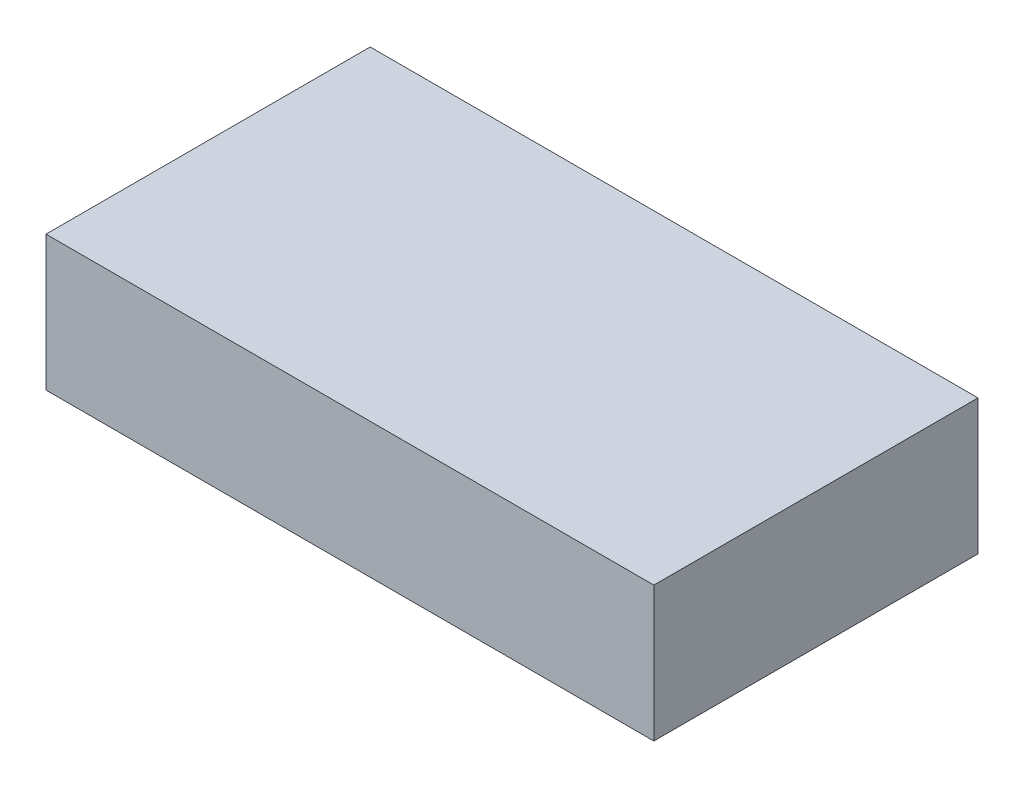
ISO-10303-21;
HEADER;
FILE_DESCRIPTION(('STEP AP214'),'2;1');
FILE_NAME('part.step','',(''),(''),'','','');
FILE_SCHEMA(('AUTOMOTIVE_DESIGN { 1 0 10303 214 1 1 1 1 }'));
ENDSEC;
DATA;
#1=APPLICATION_CONTEXT('core data for automotive mechanical design processes');
#2=APPLICATION_PROTOCOL_DEFINITION('international standard','automotive_design',2000,#1);
#3=PRODUCT_CONTEXT('',#1,'mechanical');
#4=PRODUCT('Part','Part','',(#3));
#5=PRODUCT_RELATED_PRODUCT_CATEGORY('part','',(#4));
#6=PRODUCT_DEFINITION_FORMATION('','',#4);
#7=PRODUCT_DEFINITION_CONTEXT('part definition',#1,'design');
#8=PRODUCT_DEFINITION('design','',#6,#7);
#9=PRODUCT_DEFINITION_SHAPE('','',#8);
#10=(LENGTH_UNIT() NAMED_UNIT(*) SI_UNIT(.MILLI.,.METRE.));
#11=(NAMED_UNIT(*) PLANE_ANGLE_UNIT() SI_UNIT($,.RADIAN.));
#12=(NAMED_UNIT(*) SI_UNIT($,.STERADIAN.) SOLID_ANGLE_UNIT());
#13=UNCERTAINTY_MEASURE_WITH_UNIT(LENGTH_MEASURE(1.E-05),#10,'distance_accuracy_value','');
#14=(GEOMETRIC_REPRESENTATION_CONTEXT(3) GLOBAL_UNCERTAINTY_ASSIGNED_CONTEXT((#13)) GLOBAL_UNIT_ASSIGNED_CONTEXT((#10,
#11,#12)) REPRESENTATION_CONTEXT('',''));
#15=CARTESIAN_POINT('',(0.,0.,0.));
#16=DIRECTION('',(0.,0.,1.));
#17=DIRECTION('',(1.,0.,0.));
#18=AXIS2_PLACEMENT_3D('',#15,#16,#17);
#19=CARTESIAN_POINT('',(0.,10.,0.));
#20=DIRECTION('',(1.,0.,0.));
#21=DIRECTION('',(0.,0.,-1.));
#22=AXIS2_PLACEMENT_3D('',#19,#20,#21);
#23=PLANE('',#22);
#24=DIRECTION('',(0.,0.,1.));
#25=VECTOR('',#24,1.);
#26=CARTESIAN_POINT('',(0.,0.,0.));
#27=LINE('',#26,#25);
#28=CARTESIAN_POINT('',(0.,0.,-24.));
#29=VERTEX_POINT('',#28);
#30=CARTESIAN_POINT('',(0.,0.,0.));
#31=VERTEX_POINT('',#30);
#32=EDGE_CURVE('E96',#29,#31,#27,.T.);
#33=ORIENTED_EDGE('',*,*,#32,.T.);
#34=DIRECTION('',(0.,-1.,0.));
#35=VECTOR('',#34,1.);
#36=CARTESIAN_POINT('',(0.,10.,0.));
#37=LINE('',#36,#35);
#38=CARTESIAN_POINT('',(0.,10.,0.));
#39=VERTEX_POINT('',#38);
#40=EDGE_CURVE('E11',#39,#31,#37,.T.);
#41=ORIENTED_EDGE('',*,*,#40,.F.);
#42=DIRECTION('',(0.,0.,1.));
#43=VECTOR('',#42,1.);
#44=CARTESIAN_POINT('',(0.,10.,0.));
#45=LINE('',#44,#43);
#46=CARTESIAN_POINT('',(0.,10.,-24.));
#47=VERTEX_POINT('',#46);
#48=EDGE_CURVE('E84',#47,#39,#45,.T.);
#49=ORIENTED_EDGE('',*,*,#48,.F.);
#50=DIRECTION('',(0.,-1.,0.));
#51=VECTOR('',#50,1.);
#52=CARTESIAN_POINT('',(0.,10.,-24.));
#53=LINE('',#52,#51);
#54=EDGE_CURVE('E92',#47,#29,#53,.T.);
#55=ORIENTED_EDGE('',*,*,#54,.T.);
#56=EDGE_LOOP('',(#33,#41,#49,#55));
#57=FACE_BOUND('',#56,.T.);
#58=ADVANCED_FACE('F33',(#57),#23,.F.);
#59=CARTESIAN_POINT('',(0.,10.,0.));
#60=DIRECTION('',(0.,0.,-1.));
#61=DIRECTION('',(-1.,0.,0.));
#62=AXIS2_PLACEMENT_3D('',#59,#60,#61);
#63=PLANE('',#62);
#64=DIRECTION('',(1.,0.,0.));
#65=VECTOR('',#64,1.);
#66=CARTESIAN_POINT('',(0.,0.,0.));
#67=LINE('',#66,#65);
#68=CARTESIAN_POINT('',(45.,0.,0.));
#69=VERTEX_POINT('',#68);
#70=EDGE_CURVE('E88',#31,#69,#67,.T.);
#71=ORIENTED_EDGE('',*,*,#70,.T.);
#72=DIRECTION('',(0.,-1.,0.));
#73=VECTOR('',#72,1.);
#74=CARTESIAN_POINT('',(45.,10.,0.));
#75=LINE('',#74,#73);
#76=CARTESIAN_POINT('',(45.,10.,0.));
#77=VERTEX_POINT('',#76);
#78=EDGE_CURVE('E41',#77,#69,#75,.T.);
#79=ORIENTED_EDGE('',*,*,#78,.F.);
#80=DIRECTION('',(1.,0.,0.));
#81=VECTOR('',#80,1.);
#82=CARTESIAN_POINT('',(0.,10.,0.));
#83=LINE('',#82,#81);
#84=EDGE_CURVE('E79',#39,#77,#83,.T.);
#85=ORIENTED_EDGE('',*,*,#84,.F.);
#86=ORIENTED_EDGE('',*,*,#40,.T.);
#87=EDGE_LOOP('',(#71,#79,#85,#86));
#88=FACE_BOUND('',#87,.T.);
#89=ADVANCED_FACE('F87',(#88),#63,.F.);
#90=CARTESIAN_POINT('',(45.,10.,0.));
#91=DIRECTION('',(-1.,0.,0.));
#92=DIRECTION('',(0.,0.,1.));
#93=AXIS2_PLACEMENT_3D('',#90,#91,#92);
#94=PLANE('',#93);
#95=DIRECTION('',(0.,0.,-1.));
#96=VECTOR('',#95,1.);
#97=CARTESIAN_POINT('',(45.,0.,0.));
#98=LINE('',#97,#96);
#99=CARTESIAN_POINT('',(45.,0.,-24.));
#100=VERTEX_POINT('',#99);
#101=EDGE_CURVE('E66',#69,#100,#98,.T.);
#102=ORIENTED_EDGE('',*,*,#101,.T.);
#103=DIRECTION('',(0.,-1.,0.));
#104=VECTOR('',#103,1.);
#105=CARTESIAN_POINT('',(45.,10.,-24.));
#106=LINE('',#105,#104);
#107=CARTESIAN_POINT('',(45.,10.,-24.));
#108=VERTEX_POINT('',#107);
#109=EDGE_CURVE('E89',#108,#100,#106,.T.);
#110=ORIENTED_EDGE('',*,*,#109,.F.);
#111=DIRECTION('',(0.,0.,-1.));
#112=VECTOR('',#111,1.);
#113=CARTESIAN_POINT('',(45.,10.,0.));
#114=LINE('',#113,#112);
#115=EDGE_CURVE('E82',#77,#108,#114,.T.);
#116=ORIENTED_EDGE('',*,*,#115,.F.);
#117=ORIENTED_EDGE('',*,*,#78,.T.);
#118=EDGE_LOOP('',(#102,#110,#116,#117));
#119=FACE_BOUND('',#118,.T.);
#120=ADVANCED_FACE('F90',(#119),#94,.F.);
#121=CARTESIAN_POINT('',(0.,10.,-24.));
#122=DIRECTION('',(0.,0.,1.));
#123=DIRECTION('',(1.,0.,0.));
#124=AXIS2_PLACEMENT_3D('',#121,#122,#123);
#125=PLANE('',#124);
#126=DIRECTION('',(-1.,0.,0.));
#127=VECTOR('',#126,1.);
#128=CARTESIAN_POINT('',(0.,0.,-24.));
#129=LINE('',#128,#127);
#130=EDGE_CURVE('E72',#100,#29,#129,.T.);
#131=ORIENTED_EDGE('',*,*,#130,.T.);
#132=ORIENTED_EDGE('',*,*,#54,.F.);
#133=DIRECTION('',(-1.,0.,0.));
#134=VECTOR('',#133,1.);
#135=CARTESIAN_POINT('',(0.,10.,-24.));
#136=LINE('',#135,#134);
#137=EDGE_CURVE('E49',#108,#47,#136,.T.);
#138=ORIENTED_EDGE('',*,*,#137,.F.);
#139=ORIENTED_EDGE('',*,*,#109,.T.);
#140=EDGE_LOOP('',(#131,#132,#138,#139));
#141=FACE_BOUND('',#140,.T.);
#142=ADVANCED_FACE('F103',(#141),#125,.F.);
#143=CARTESIAN_POINT('',(0.,10.,0.));
#144=DIRECTION('',(0.,-1.,0.));
#145=DIRECTION('',(0.,0.,-1.));
#146=AXIS2_PLACEMENT_3D('',#143,#144,#145);
#147=PLANE('',#146);
#148=ORIENTED_EDGE('',*,*,#48,.T.);
#149=ORIENTED_EDGE('',*,*,#84,.T.);
#150=ORIENTED_EDGE('',*,*,#115,.T.);
#151=ORIENTED_EDGE('',*,*,#137,.T.);
#152=EDGE_LOOP('',(#148,#149,#150,#151));
#153=FACE_BOUND('',#152,.T.);
#154=ADVANCED_FACE('F80',(#153),#147,.F.);
#155=CARTESIAN_POINT('',(0.,0.,0.));
#156=DIRECTION('',(0.,-1.,0.));
#157=DIRECTION('',(0.,0.,-1.));
#158=AXIS2_PLACEMENT_3D('',#155,#156,#157);
#159=PLANE('',#158);
#160=ORIENTED_EDGE('',*,*,#32,.F.);
#161=ORIENTED_EDGE('',*,*,#130,.F.);
#162=ORIENTED_EDGE('',*,*,#101,.F.);
#163=ORIENTED_EDGE('',*,*,#70,.F.);
#164=EDGE_LOOP('',(#160,#161,#162,#163));
#165=FACE_BOUND('',#164,.T.);
#166=ADVANCED_FACE('F106',(#165),#159,.T.);
#167=CLOSED_SHELL('',(#58,#89,#120,#142,#154,#166));
#168=MANIFOLD_SOLID_BREP('B2',#167);
#169=ADVANCED_BREP_SHAPE_REPRESENTATION('',(#18,#168),#14);
#170=SHAPE_DEFINITION_REPRESENTATION(#9,#169);
ENDSEC;
END-ISO-10303-21;
